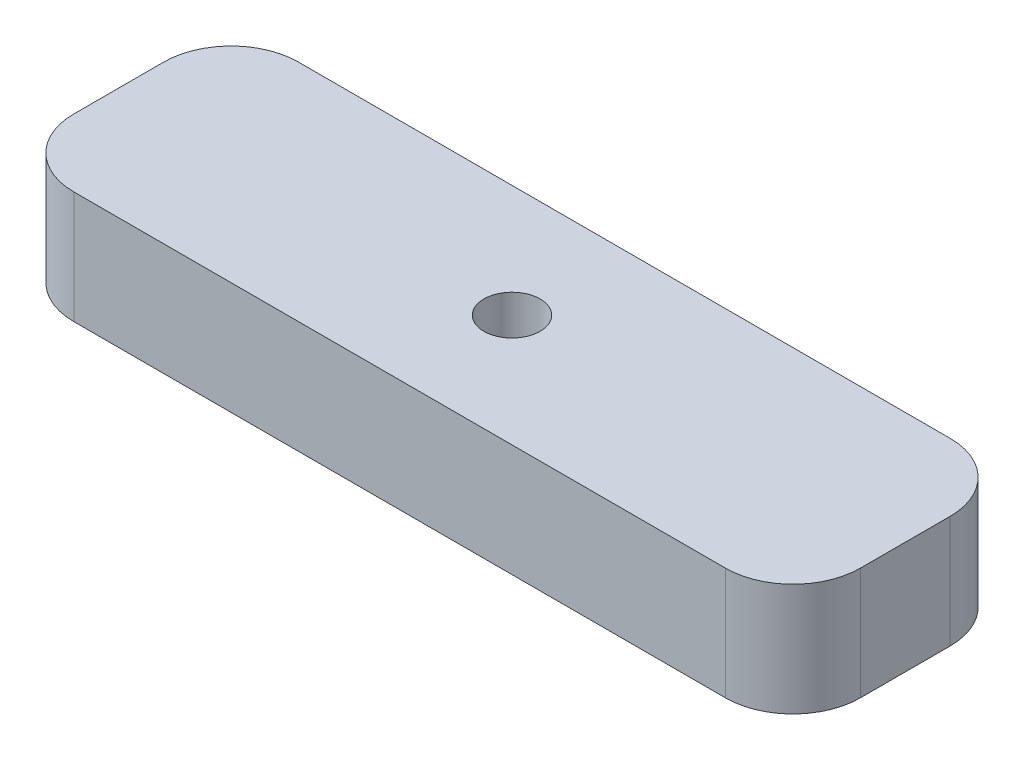
ISO-10303-21;
HEADER;
FILE_DESCRIPTION(('STEP AP214'),'2;1');
FILE_NAME('part.step','',(''),(''),'','','');
FILE_SCHEMA(('AUTOMOTIVE_DESIGN { 1 0 10303 214 1 1 1 1 }'));
ENDSEC;
DATA;
#1=APPLICATION_CONTEXT('core data for automotive mechanical design processes');
#2=APPLICATION_PROTOCOL_DEFINITION('international standard','automotive_design',2000,#1);
#3=PRODUCT_CONTEXT('',#1,'mechanical');
#4=PRODUCT('Part','Part','',(#3));
#5=PRODUCT_RELATED_PRODUCT_CATEGORY('part','',(#4));
#6=PRODUCT_DEFINITION_FORMATION('','',#4);
#7=PRODUCT_DEFINITION_CONTEXT('part definition',#1,'design');
#8=PRODUCT_DEFINITION('design','',#6,#7);
#9=PRODUCT_DEFINITION_SHAPE('','',#8);
#10=(LENGTH_UNIT() NAMED_UNIT(*) SI_UNIT(.MILLI.,.METRE.));
#11=(NAMED_UNIT(*) PLANE_ANGLE_UNIT() SI_UNIT($,.RADIAN.));
#12=(NAMED_UNIT(*) SI_UNIT($,.STERADIAN.) SOLID_ANGLE_UNIT());
#13=UNCERTAINTY_MEASURE_WITH_UNIT(LENGTH_MEASURE(1.E-05),#10,'distance_accuracy_value','');
#14=(GEOMETRIC_REPRESENTATION_CONTEXT(3) GLOBAL_UNCERTAINTY_ASSIGNED_CONTEXT((#13)) GLOBAL_UNIT_ASSIGNED_CONTEXT((#10,
#11,#12)) REPRESENTATION_CONTEXT('',''));
#15=CARTESIAN_POINT('',(0.,0.,0.));
#16=DIRECTION('',(0.,0.,1.));
#17=DIRECTION('',(1.,0.,0.));
#18=AXIS2_PLACEMENT_3D('',#15,#16,#17);
#19=CARTESIAN_POINT('',(0.,5.,0.));
#20=DIRECTION('',(0.,-1.,0.));
#21=DIRECTION('',(0.,0.,-1.));
#22=AXIS2_PLACEMENT_3D('',#19,#20,#21);
#23=PLANE('',#22);
#24=DIRECTION('',(0.,0.,1.));
#25=VECTOR('',#24,1.);
#26=CARTESIAN_POINT('',(-17.5,5.,5.));
#27=LINE('',#26,#25);
#28=CARTESIAN_POINT('',(-17.5,5.,-2.));
#29=VERTEX_POINT('',#28);
#30=CARTESIAN_POINT('',(-17.5,5.,2.));
#31=VERTEX_POINT('',#30);
#32=EDGE_CURVE('E178',#29,#31,#27,.T.);
#33=ORIENTED_EDGE('',*,*,#32,.T.);
#34=CARTESIAN_POINT('',(-14.5,5.,2.));
#35=DIRECTION('',(0.,-1.,0.));
#36=DIRECTION('',(0.,0.,-1.));
#37=AXIS2_PLACEMENT_3D('',#34,#35,#36);
#38=CIRCLE('',#37,3.);
#39=CARTESIAN_POINT('',(-14.5,5.,5.));
#40=VERTEX_POINT('',#39);
#41=EDGE_CURVE('E155',#31,#40,#38,.F.);
#42=ORIENTED_EDGE('',*,*,#41,.T.);
#43=DIRECTION('',(1.,0.,0.));
#44=VECTOR('',#43,1.);
#45=CARTESIAN_POINT('',(-17.5,5.,5.));
#46=LINE('',#45,#44);
#47=CARTESIAN_POINT('',(14.5,5.,5.));
#48=VERTEX_POINT('',#47);
#49=EDGE_CURVE('E126',#40,#48,#46,.T.);
#50=ORIENTED_EDGE('',*,*,#49,.T.);
#51=CARTESIAN_POINT('',(14.5,5.,2.));
#52=DIRECTION('',(0.,-1.,0.));
#53=DIRECTION('',(0.,0.,-1.));
#54=AXIS2_PLACEMENT_3D('',#51,#52,#53);
#55=CIRCLE('',#54,3.);
#56=CARTESIAN_POINT('',(17.5,5.,2.));
#57=VERTEX_POINT('',#56);
#58=EDGE_CURVE('E151',#48,#57,#55,.F.);
#59=ORIENTED_EDGE('',*,*,#58,.T.);
#60=DIRECTION('',(0.,0.,-1.));
#61=VECTOR('',#60,1.);
#62=CARTESIAN_POINT('',(17.5,5.,5.));
#63=LINE('',#62,#61);
#64=CARTESIAN_POINT('',(17.5,5.,-2.));
#65=VERTEX_POINT('',#64);
#66=EDGE_CURVE('E134',#57,#65,#63,.T.);
#67=ORIENTED_EDGE('',*,*,#66,.T.);
#68=CARTESIAN_POINT('',(14.5,5.,-2.));
#69=DIRECTION('',(0.,-1.,0.));
#70=DIRECTION('',(0.,0.,-1.));
#71=AXIS2_PLACEMENT_3D('',#68,#69,#70);
#72=CIRCLE('',#71,3.);
#73=CARTESIAN_POINT('',(14.5,5.,-5.));
#74=VERTEX_POINT('',#73);
#75=EDGE_CURVE('E61',#65,#74,#72,.F.);
#76=ORIENTED_EDGE('',*,*,#75,.T.);
#77=DIRECTION('',(-1.,0.,0.));
#78=VECTOR('',#77,1.);
#79=CARTESIAN_POINT('',(-17.5,5.,-5.));
#80=LINE('',#79,#78);
#81=CARTESIAN_POINT('',(-14.5,5.,-5.));
#82=VERTEX_POINT('',#81);
#83=EDGE_CURVE('E137',#74,#82,#80,.T.);
#84=ORIENTED_EDGE('',*,*,#83,.T.);
#85=CARTESIAN_POINT('',(-14.5,5.,-2.));
#86=DIRECTION('',(0.,-1.,0.));
#87=DIRECTION('',(0.,0.,-1.));
#88=AXIS2_PLACEMENT_3D('',#85,#86,#87);
#89=CIRCLE('',#88,3.);
#90=EDGE_CURVE('E153',#82,#29,#89,.F.);
#91=ORIENTED_EDGE('',*,*,#90,.T.);
#92=EDGE_LOOP('',(#33,#42,#50,#59,#67,#76,#84,#91));
#93=FACE_BOUND('',#92,.T.);
#94=CARTESIAN_POINT('',(0.,5.,0.));
#95=DIRECTION('',(0.,1.,0.));
#96=DIRECTION('',(0.,0.,1.));
#97=AXIS2_PLACEMENT_3D('',#94,#95,#96);
#98=CIRCLE('',#97,1.25);
#99=CARTESIAN_POINT('',(0.,5.,1.25));
#100=VERTEX_POINT('',#99);
#101=EDGE_CURVE('E174',#100,#100,#98,.T.);
#102=ORIENTED_EDGE('',*,*,#101,.F.);
#103=EDGE_LOOP('',(#102));
#104=FACE_BOUND('',#103,.T.);
#105=ADVANCED_FACE('F39',(#93,#104),#23,.F.);
#106=CARTESIAN_POINT('',(0.,0.,0.));
#107=DIRECTION('',(0.,-1.,0.));
#108=DIRECTION('',(0.,0.,-1.));
#109=AXIS2_PLACEMENT_3D('',#106,#107,#108);
#110=PLANE('',#109);
#111=DIRECTION('',(1.,0.,0.));
#112=VECTOR('',#111,1.);
#113=CARTESIAN_POINT('',(-17.5,0.,5.));
#114=LINE('',#113,#112);
#115=CARTESIAN_POINT('',(-14.5,0.,5.));
#116=VERTEX_POINT('',#115);
#117=CARTESIAN_POINT('',(14.5,0.,5.));
#118=VERTEX_POINT('',#117);
#119=EDGE_CURVE('E123',#116,#118,#114,.T.);
#120=ORIENTED_EDGE('',*,*,#119,.F.);
#121=CARTESIAN_POINT('',(-14.5,0.,2.));
#122=DIRECTION('',(0.,-1.,0.));
#123=DIRECTION('',(0.,0.,-1.));
#124=AXIS2_PLACEMENT_3D('',#121,#122,#123);
#125=CIRCLE('',#124,3.);
#126=CARTESIAN_POINT('',(-17.5,0.,2.));
#127=VERTEX_POINT('',#126);
#128=EDGE_CURVE('E106',#116,#127,#125,.T.);
#129=ORIENTED_EDGE('',*,*,#128,.T.);
#130=DIRECTION('',(0.,0.,1.));
#131=VECTOR('',#130,1.);
#132=CARTESIAN_POINT('',(-17.5,0.,5.));
#133=LINE('',#132,#131);
#134=CARTESIAN_POINT('',(-17.5,0.,-2.));
#135=VERTEX_POINT('',#134);
#136=EDGE_CURVE('E135',#135,#127,#133,.T.);
#137=ORIENTED_EDGE('',*,*,#136,.F.);
#138=CARTESIAN_POINT('',(-14.5,0.,-2.));
#139=DIRECTION('',(0.,-1.,0.));
#140=DIRECTION('',(0.,0.,-1.));
#141=AXIS2_PLACEMENT_3D('',#138,#139,#140);
#142=CIRCLE('',#141,3.);
#143=CARTESIAN_POINT('',(-14.5,0.,-5.));
#144=VERTEX_POINT('',#143);
#145=EDGE_CURVE('E117',#135,#144,#142,.T.);
#146=ORIENTED_EDGE('',*,*,#145,.T.);
#147=DIRECTION('',(-1.,0.,0.));
#148=VECTOR('',#147,1.);
#149=CARTESIAN_POINT('',(-17.5,0.,-5.));
#150=LINE('',#149,#148);
#151=CARTESIAN_POINT('',(14.5,0.,-5.));
#152=VERTEX_POINT('',#151);
#153=EDGE_CURVE('E139',#152,#144,#150,.T.);
#154=ORIENTED_EDGE('',*,*,#153,.F.);
#155=CARTESIAN_POINT('',(14.5,0.,-2.));
#156=DIRECTION('',(0.,-1.,0.));
#157=DIRECTION('',(0.,0.,-1.));
#158=AXIS2_PLACEMENT_3D('',#155,#156,#157);
#159=CIRCLE('',#158,3.);
#160=CARTESIAN_POINT('',(17.5,0.,-2.));
#161=VERTEX_POINT('',#160);
#162=EDGE_CURVE('E127',#152,#161,#159,.T.);
#163=ORIENTED_EDGE('',*,*,#162,.T.);
#164=DIRECTION('',(0.,0.,-1.));
#165=VECTOR('',#164,1.);
#166=CARTESIAN_POINT('',(17.5,0.,5.));
#167=LINE('',#166,#165);
#168=CARTESIAN_POINT('',(17.5,0.,2.));
#169=VERTEX_POINT('',#168);
#170=EDGE_CURVE('E166',#169,#161,#167,.T.);
#171=ORIENTED_EDGE('',*,*,#170,.F.);
#172=CARTESIAN_POINT('',(14.5,0.,2.));
#173=DIRECTION('',(0.,-1.,0.));
#174=DIRECTION('',(0.,0.,-1.));
#175=AXIS2_PLACEMENT_3D('',#172,#173,#174);
#176=CIRCLE('',#175,3.);
#177=EDGE_CURVE('E133',#169,#118,#176,.T.);
#178=ORIENTED_EDGE('',*,*,#177,.T.);
#179=EDGE_LOOP('',(#120,#129,#137,#146,#154,#163,#171,#178));
#180=FACE_BOUND('',#179,.T.);
#181=CARTESIAN_POINT('',(0.,0.,0.));
#182=DIRECTION('',(0.,1.,0.));
#183=DIRECTION('',(0.,0.,1.));
#184=AXIS2_PLACEMENT_3D('',#181,#182,#183);
#185=CIRCLE('',#184,1.25);
#186=CARTESIAN_POINT('',(0.,0.,1.25));
#187=VERTEX_POINT('',#186);
#188=EDGE_CURVE('E181',#187,#187,#185,.T.);
#189=ORIENTED_EDGE('',*,*,#188,.T.);
#190=EDGE_LOOP('',(#189));
#191=FACE_BOUND('',#190,.T.);
#192=ADVANCED_FACE('F130',(#180,#191),#110,.T.);
#193=CARTESIAN_POINT('',(17.5,5.,5.));
#194=DIRECTION('',(-1.,0.,0.));
#195=DIRECTION('',(0.,0.,1.));
#196=AXIS2_PLACEMENT_3D('',#193,#194,#195);
#197=PLANE('',#196);
#198=ORIENTED_EDGE('',*,*,#66,.F.);
#199=DIRECTION('',(0.,-1.,0.));
#200=VECTOR('',#199,1.);
#201=CARTESIAN_POINT('',(17.5,5.,2.));
#202=LINE('',#201,#200);
#203=EDGE_CURVE('E11',#57,#169,#202,.T.);
#204=ORIENTED_EDGE('',*,*,#203,.T.);
#205=ORIENTED_EDGE('',*,*,#170,.T.);
#206=DIRECTION('',(0.,-1.,0.));
#207=VECTOR('',#206,1.);
#208=CARTESIAN_POINT('',(17.5,5.,-2.));
#209=LINE('',#208,#207);
#210=EDGE_CURVE('E47',#161,#65,#209,.F.);
#211=ORIENTED_EDGE('',*,*,#210,.T.);
#212=EDGE_LOOP('',(#198,#204,#205,#211));
#213=FACE_BOUND('',#212,.T.);
#214=ADVANCED_FACE('F164',(#213),#197,.F.);
#215=CARTESIAN_POINT('',(-17.5,5.,-5.));
#216=DIRECTION('',(0.,0.,1.));
#217=DIRECTION('',(1.,0.,0.));
#218=AXIS2_PLACEMENT_3D('',#215,#216,#217);
#219=PLANE('',#218);
#220=ORIENTED_EDGE('',*,*,#153,.T.);
#221=DIRECTION('',(0.,-1.,0.));
#222=VECTOR('',#221,1.);
#223=CARTESIAN_POINT('',(-14.5,5.,-5.));
#224=LINE('',#223,#222);
#225=EDGE_CURVE('E54',#144,#82,#224,.F.);
#226=ORIENTED_EDGE('',*,*,#225,.T.);
#227=ORIENTED_EDGE('',*,*,#83,.F.);
#228=DIRECTION('',(0.,-1.,0.));
#229=VECTOR('',#228,1.);
#230=CARTESIAN_POINT('',(14.5,5.,-5.));
#231=LINE('',#230,#229);
#232=EDGE_CURVE('E157',#74,#152,#231,.T.);
#233=ORIENTED_EDGE('',*,*,#232,.T.);
#234=EDGE_LOOP('',(#220,#226,#227,#233));
#235=FACE_BOUND('',#234,.T.);
#236=ADVANCED_FACE('F173',(#235),#219,.F.);
#237=CARTESIAN_POINT('',(-17.5,5.,5.));
#238=DIRECTION('',(1.,0.,0.));
#239=DIRECTION('',(0.,0.,-1.));
#240=AXIS2_PLACEMENT_3D('',#237,#238,#239);
#241=PLANE('',#240);
#242=ORIENTED_EDGE('',*,*,#136,.T.);
#243=DIRECTION('',(0.,-1.,0.));
#244=VECTOR('',#243,1.);
#245=CARTESIAN_POINT('',(-17.5,5.,2.));
#246=LINE('',#245,#244);
#247=EDGE_CURVE('E111',#127,#31,#246,.F.);
#248=ORIENTED_EDGE('',*,*,#247,.T.);
#249=ORIENTED_EDGE('',*,*,#32,.F.);
#250=DIRECTION('',(0.,-1.,0.));
#251=VECTOR('',#250,1.);
#252=CARTESIAN_POINT('',(-17.5,5.,-2.));
#253=LINE('',#252,#251);
#254=EDGE_CURVE('E116',#29,#135,#253,.T.);
#255=ORIENTED_EDGE('',*,*,#254,.T.);
#256=EDGE_LOOP('',(#242,#248,#249,#255));
#257=FACE_BOUND('',#256,.T.);
#258=ADVANCED_FACE('F200',(#257),#241,.F.);
#259=CARTESIAN_POINT('',(-17.5,5.,5.));
#260=DIRECTION('',(0.,0.,-1.));
#261=DIRECTION('',(-1.,0.,0.));
#262=AXIS2_PLACEMENT_3D('',#259,#260,#261);
#263=PLANE('',#262);
#264=ORIENTED_EDGE('',*,*,#49,.F.);
#265=DIRECTION('',(0.,-1.,0.));
#266=VECTOR('',#265,1.);
#267=CARTESIAN_POINT('',(-14.5,5.,5.));
#268=LINE('',#267,#266);
#269=EDGE_CURVE('E110',#40,#116,#268,.T.);
#270=ORIENTED_EDGE('',*,*,#269,.T.);
#271=ORIENTED_EDGE('',*,*,#119,.T.);
#272=DIRECTION('',(0.,-1.,0.));
#273=VECTOR('',#272,1.);
#274=CARTESIAN_POINT('',(14.5,5.,5.));
#275=LINE('',#274,#273);
#276=EDGE_CURVE('E128',#118,#48,#275,.F.);
#277=ORIENTED_EDGE('',*,*,#276,.T.);
#278=EDGE_LOOP('',(#264,#270,#271,#277));
#279=FACE_BOUND('',#278,.T.);
#280=ADVANCED_FACE('F122',(#279),#263,.F.);
#281=CARTESIAN_POINT('',(0.,5.,0.));
#282=DIRECTION('',(0.,-1.,0.));
#283=DIRECTION('',(0.,0.,-1.));
#284=AXIS2_PLACEMENT_3D('',#281,#282,#283);
#285=CYLINDRICAL_SURFACE('',#284,1.25);
#286=ORIENTED_EDGE('',*,*,#101,.T.);
#287=EDGE_LOOP('',(#286));
#288=FACE_BOUND('',#287,.T.);
#289=ORIENTED_EDGE('',*,*,#188,.F.);
#290=EDGE_LOOP('',(#289));
#291=FACE_BOUND('',#290,.T.);
#292=ADVANCED_FACE('F187',(#288,#291),#285,.F.);
#293=CARTESIAN_POINT('',(-14.5,5.,2.));
#294=DIRECTION('',(0.,-1.,0.));
#295=DIRECTION('',(0.,0.,-1.));
#296=AXIS2_PLACEMENT_3D('',#293,#294,#295);
#297=CYLINDRICAL_SURFACE('',#296,3.);
#298=ORIENTED_EDGE('',*,*,#41,.F.);
#299=ORIENTED_EDGE('',*,*,#247,.F.);
#300=ORIENTED_EDGE('',*,*,#128,.F.);
#301=ORIENTED_EDGE('',*,*,#269,.F.);
#302=EDGE_LOOP('',(#298,#299,#300,#301));
#303=FACE_BOUND('',#302,.T.);
#304=ADVANCED_FACE('F109',(#303),#297,.T.);
#305=CARTESIAN_POINT('',(-14.5,5.,-2.));
#306=DIRECTION('',(0.,-1.,0.));
#307=DIRECTION('',(0.,0.,-1.));
#308=AXIS2_PLACEMENT_3D('',#305,#306,#307);
#309=CYLINDRICAL_SURFACE('',#308,3.);
#310=ORIENTED_EDGE('',*,*,#90,.F.);
#311=ORIENTED_EDGE('',*,*,#225,.F.);
#312=ORIENTED_EDGE('',*,*,#145,.F.);
#313=ORIENTED_EDGE('',*,*,#254,.F.);
#314=EDGE_LOOP('',(#310,#311,#312,#313));
#315=FACE_BOUND('',#314,.T.);
#316=ADVANCED_FACE('F210',(#315),#309,.T.);
#317=CARTESIAN_POINT('',(14.5,5.,2.));
#318=DIRECTION('',(0.,-1.,0.));
#319=DIRECTION('',(0.,0.,-1.));
#320=AXIS2_PLACEMENT_3D('',#317,#318,#319);
#321=CYLINDRICAL_SURFACE('',#320,3.);
#322=ORIENTED_EDGE('',*,*,#58,.F.);
#323=ORIENTED_EDGE('',*,*,#276,.F.);
#324=ORIENTED_EDGE('',*,*,#177,.F.);
#325=ORIENTED_EDGE('',*,*,#203,.F.);
#326=EDGE_LOOP('',(#322,#323,#324,#325));
#327=FACE_BOUND('',#326,.T.);
#328=ADVANCED_FACE('F212',(#327),#321,.T.);
#329=CARTESIAN_POINT('',(14.5,5.,-2.));
#330=DIRECTION('',(0.,-1.,0.));
#331=DIRECTION('',(0.,0.,-1.));
#332=AXIS2_PLACEMENT_3D('',#329,#330,#331);
#333=CYLINDRICAL_SURFACE('',#332,3.);
#334=ORIENTED_EDGE('',*,*,#75,.F.);
#335=ORIENTED_EDGE('',*,*,#210,.F.);
#336=ORIENTED_EDGE('',*,*,#162,.F.);
#337=ORIENTED_EDGE('',*,*,#232,.F.);
#338=EDGE_LOOP('',(#334,#335,#336,#337));
#339=FACE_BOUND('',#338,.T.);
#340=ADVANCED_FACE('F41',(#339),#333,.T.);
#341=CLOSED_SHELL('',(#105,#192,#214,#236,#258,#280,#292,#304,#316,#328,#340));
#342=MANIFOLD_SOLID_BREP('B2',#341);
#343=ADVANCED_BREP_SHAPE_REPRESENTATION('',(#18,#342),#14);
#344=SHAPE_DEFINITION_REPRESENTATION(#9,#343);
ENDSEC;
END-ISO-10303-21;
